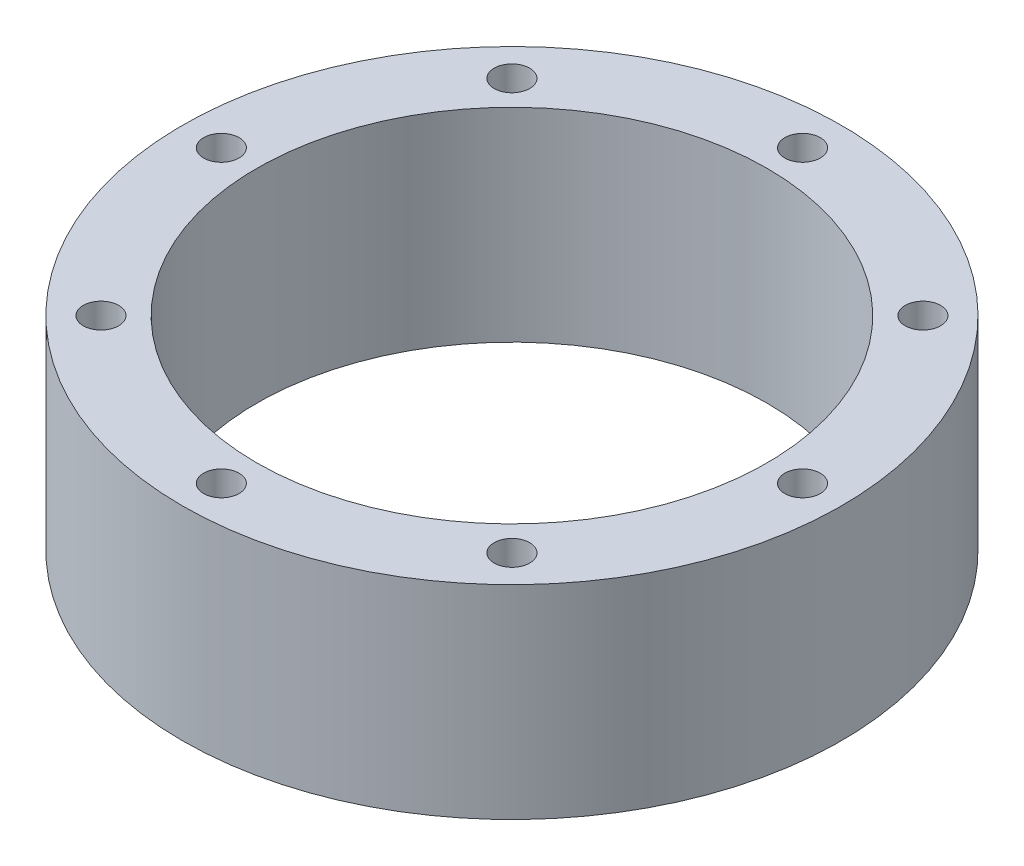
ISO-10303-21;
HEADER;
FILE_DESCRIPTION(('STEP AP214'),'2;1');
FILE_NAME('part.step','',(''),(''),'','','');
FILE_SCHEMA(('AUTOMOTIVE_DESIGN { 1 0 10303 214 1 1 1 1 }'));
ENDSEC;
DATA;
#1=APPLICATION_CONTEXT('core data for automotive mechanical design processes');
#2=APPLICATION_PROTOCOL_DEFINITION('international standard','automotive_design',2000,#1);
#3=PRODUCT_CONTEXT('',#1,'mechanical');
#4=PRODUCT('Part','Part','',(#3));
#5=PRODUCT_RELATED_PRODUCT_CATEGORY('part','',(#4));
#6=PRODUCT_DEFINITION_FORMATION('','',#4);
#7=PRODUCT_DEFINITION_CONTEXT('part definition',#1,'design');
#8=PRODUCT_DEFINITION('design','',#6,#7);
#9=PRODUCT_DEFINITION_SHAPE('','',#8);
#10=(LENGTH_UNIT() NAMED_UNIT(*) SI_UNIT(.MILLI.,.METRE.));
#11=(NAMED_UNIT(*) PLANE_ANGLE_UNIT() SI_UNIT($,.RADIAN.));
#12=(NAMED_UNIT(*) SI_UNIT($,.STERADIAN.) SOLID_ANGLE_UNIT());
#13=UNCERTAINTY_MEASURE_WITH_UNIT(LENGTH_MEASURE(1.E-05),#10,'distance_accuracy_value','');
#14=(GEOMETRIC_REPRESENTATION_CONTEXT(3) GLOBAL_UNCERTAINTY_ASSIGNED_CONTEXT((#13)) GLOBAL_UNIT_ASSIGNED_CONTEXT((#10,
#11,#12)) REPRESENTATION_CONTEXT('',''));
#15=CARTESIAN_POINT('',(0.,0.,0.));
#16=DIRECTION('',(0.,0.,1.));
#17=DIRECTION('',(1.,0.,0.));
#18=AXIS2_PLACEMENT_3D('',#15,#16,#17);
#19=CARTESIAN_POINT('',(0.,28.7,0.));
#20=DIRECTION('',(0.,1.,0.));
#21=DIRECTION('',(0.,0.,1.));
#22=AXIS2_PLACEMENT_3D('',#19,#20,#21);
#23=PLANE('',#22);
#24=CARTESIAN_POINT('',(0.,28.7,-41.));
#25=DIRECTION('',(0.,1.,0.));
#26=DIRECTION('',(0.,0.,1.));
#27=AXIS2_PLACEMENT_3D('',#24,#25,#26);
#28=CIRCLE('',#27,2.5);
#29=CARTESIAN_POINT('',(0.,28.7,-38.5));
#30=VERTEX_POINT('',#29);
#31=EDGE_CURVE('E96',#30,#30,#28,.T.);
#32=ORIENTED_EDGE('',*,*,#31,.F.);
#33=EDGE_LOOP('',(#32));
#34=FACE_BOUND('',#33,.T.);
#35=CARTESIAN_POINT('',(28.991378028649,28.7,-28.9913780286484));
#36=DIRECTION('',(0.,1.,0.));
#37=DIRECTION('',(0.,0.,1.));
#38=AXIS2_PLACEMENT_3D('',#35,#36,#37);
#39=CIRCLE('',#38,2.4999999999996);
#40=CARTESIAN_POINT('',(28.991378028649,28.7,-26.4913780286488));
#41=VERTEX_POINT('',#40);
#42=EDGE_CURVE('E93',#41,#41,#39,.T.);
#43=ORIENTED_EDGE('',*,*,#42,.F.);
#44=EDGE_LOOP('',(#43));
#45=FACE_BOUND('',#44,.T.);
#46=CARTESIAN_POINT('',(41.0000000000009,28.7,3.57978890157532E-13));
#47=DIRECTION('',(0.,1.,0.));
#48=DIRECTION('',(0.,0.,1.));
#49=AXIS2_PLACEMENT_3D('',#46,#47,#48);
#50=CIRCLE('',#49,2.49999999999953);
#51=CARTESIAN_POINT('',(41.0000000000009,28.7,2.49999999999989));
#52=VERTEX_POINT('',#51);
#53=EDGE_CURVE('E87',#52,#52,#50,.T.);
#54=ORIENTED_EDGE('',*,*,#53,.F.);
#55=EDGE_LOOP('',(#54));
#56=FACE_BOUND('',#55,.T.);
#57=CARTESIAN_POINT('',(28.9913780286484,28.7,28.9913780286484));
#58=DIRECTION('',(0.,1.,0.));
#59=DIRECTION('',(0.,0.,1.));
#60=AXIS2_PLACEMENT_3D('',#57,#58,#59);
#61=CIRCLE('',#60,2.50000000000021);
#62=CARTESIAN_POINT('',(28.9913780286484,28.7,31.4913780286487));
#63=VERTEX_POINT('',#62);
#64=EDGE_CURVE('E81',#63,#63,#61,.T.);
#65=ORIENTED_EDGE('',*,*,#64,.F.);
#66=EDGE_LOOP('',(#65));
#67=FACE_BOUND('',#66,.T.);
#68=CARTESIAN_POINT('',(0.,28.7,41.));
#69=DIRECTION('',(0.,1.,0.));
#70=DIRECTION('',(0.,0.,1.));
#71=AXIS2_PLACEMENT_3D('',#68,#69,#70);
#72=CIRCLE('',#71,2.50000000000028);
#73=CARTESIAN_POINT('',(0.,28.7,43.5000000000003));
#74=VERTEX_POINT('',#73);
#75=EDGE_CURVE('E75',#74,#74,#72,.T.);
#76=ORIENTED_EDGE('',*,*,#75,.F.);
#77=EDGE_LOOP('',(#76));
#78=FACE_BOUND('',#77,.T.);
#79=CARTESIAN_POINT('',(-28.9913780286484,28.7,28.9913780286485));
#80=DIRECTION('',(0.,1.,0.));
#81=DIRECTION('',(0.,0.,1.));
#82=AXIS2_PLACEMENT_3D('',#79,#80,#81);
#83=CIRCLE('',#82,2.50000000000035);
#84=CARTESIAN_POINT('',(-28.9913780286484,28.7,31.4913780286488));
#85=VERTEX_POINT('',#84);
#86=EDGE_CURVE('E69',#85,#85,#83,.T.);
#87=ORIENTED_EDGE('',*,*,#86,.F.);
#88=EDGE_LOOP('',(#87));
#89=FACE_BOUND('',#88,.T.);
#90=CARTESIAN_POINT('',(-41.,28.7,0.));
#91=DIRECTION('',(0.,1.,0.));
#92=DIRECTION('',(0.,0.,1.));
#93=AXIS2_PLACEMENT_3D('',#90,#91,#92);
#94=CIRCLE('',#93,2.50000000000041);
#95=CARTESIAN_POINT('',(-41.,28.7,2.50000000000042));
#96=VERTEX_POINT('',#95);
#97=EDGE_CURVE('E63',#96,#96,#94,.T.);
#98=ORIENTED_EDGE('',*,*,#97,.F.);
#99=EDGE_LOOP('',(#98));
#100=FACE_BOUND('',#99,.T.);
#101=CARTESIAN_POINT('',(-28.9913780286488,28.7,-28.9913780286481));
#102=DIRECTION('',(0.,1.,0.));
#103=DIRECTION('',(0.,0.,1.));
#104=AXIS2_PLACEMENT_3D('',#101,#102,#103);
#105=CIRCLE('',#104,2.50000000000097);
#106=CARTESIAN_POINT('',(-28.9913780286488,28.7,-26.4913780286471));
#107=VERTEX_POINT('',#106);
#108=EDGE_CURVE('E57',#107,#107,#105,.T.);
#109=ORIENTED_EDGE('',*,*,#108,.F.);
#110=EDGE_LOOP('',(#109));
#111=FACE_BOUND('',#110,.T.);
#112=CARTESIAN_POINT('',(0.,28.7,0.));
#113=DIRECTION('',(0.,1.,0.));
#114=DIRECTION('',(0.,0.,1.));
#115=AXIS2_PLACEMENT_3D('',#112,#113,#114);
#116=CIRCLE('',#115,46.5);
#117=CARTESIAN_POINT('',(0.,28.7,46.5));
#118=VERTEX_POINT('',#117);
#119=EDGE_CURVE('E10',#118,#118,#116,.T.);
#120=ORIENTED_EDGE('',*,*,#119,.T.);
#121=EDGE_LOOP('',(#120));
#122=FACE_BOUND('',#121,.T.);
#123=CARTESIAN_POINT('',(0.,28.7,0.));
#124=DIRECTION('',(0.,1.,0.));
#125=DIRECTION('',(0.,0.,1.));
#126=AXIS2_PLACEMENT_3D('',#123,#124,#125);
#127=CIRCLE('',#126,36.);
#128=CARTESIAN_POINT('',(0.,28.7,36.));
#129=VERTEX_POINT('',#128);
#130=EDGE_CURVE('E46',#129,#129,#127,.T.);
#131=ORIENTED_EDGE('',*,*,#130,.F.);
#132=EDGE_LOOP('',(#131));
#133=FACE_BOUND('',#132,.T.);
#134=ADVANCED_FACE('F35',(#34,#45,#56,#67,#78,#89,#100,#111,#122,#133),#23,.T.);
#135=CARTESIAN_POINT('',(0.,0.,0.));
#136=DIRECTION('',(0.,1.,0.));
#137=DIRECTION('',(0.,0.,1.));
#138=AXIS2_PLACEMENT_3D('',#135,#136,#137);
#139=PLANE('',#138);
#140=CARTESIAN_POINT('',(0.,0.,-41.));
#141=DIRECTION('',(0.,1.,0.));
#142=DIRECTION('',(0.,0.,1.));
#143=AXIS2_PLACEMENT_3D('',#140,#141,#142);
#144=CIRCLE('',#143,2.5);
#145=CARTESIAN_POINT('',(0.,0.,-38.5));
#146=VERTEX_POINT('',#145);
#147=EDGE_CURVE('E51',#146,#146,#144,.T.);
#148=ORIENTED_EDGE('',*,*,#147,.T.);
#149=EDGE_LOOP('',(#148));
#150=FACE_BOUND('',#149,.T.);
#151=CARTESIAN_POINT('',(28.991378028649,0.,-28.9913780286484));
#152=DIRECTION('',(0.,1.,0.));
#153=DIRECTION('',(0.,0.,1.));
#154=AXIS2_PLACEMENT_3D('',#151,#152,#153);
#155=CIRCLE('',#154,2.4999999999996);
#156=CARTESIAN_POINT('',(28.991378028649,0.,-26.4913780286488));
#157=VERTEX_POINT('',#156);
#158=EDGE_CURVE('E90',#157,#157,#155,.T.);
#159=ORIENTED_EDGE('',*,*,#158,.T.);
#160=EDGE_LOOP('',(#159));
#161=FACE_BOUND('',#160,.T.);
#162=CARTESIAN_POINT('',(41.0000000000009,0.,3.57978890157532E-13));
#163=DIRECTION('',(0.,1.,0.));
#164=DIRECTION('',(0.,0.,1.));
#165=AXIS2_PLACEMENT_3D('',#162,#163,#164);
#166=CIRCLE('',#165,2.49999999999953);
#167=CARTESIAN_POINT('',(41.0000000000009,0.,2.49999999999989));
#168=VERTEX_POINT('',#167);
#169=EDGE_CURVE('E84',#168,#168,#166,.T.);
#170=ORIENTED_EDGE('',*,*,#169,.T.);
#171=EDGE_LOOP('',(#170));
#172=FACE_BOUND('',#171,.T.);
#173=CARTESIAN_POINT('',(28.9913780286484,0.,28.9913780286484));
#174=DIRECTION('',(0.,1.,0.));
#175=DIRECTION('',(0.,0.,1.));
#176=AXIS2_PLACEMENT_3D('',#173,#174,#175);
#177=CIRCLE('',#176,2.50000000000021);
#178=CARTESIAN_POINT('',(28.9913780286484,0.,31.4913780286487));
#179=VERTEX_POINT('',#178);
#180=EDGE_CURVE('E78',#179,#179,#177,.T.);
#181=ORIENTED_EDGE('',*,*,#180,.T.);
#182=EDGE_LOOP('',(#181));
#183=FACE_BOUND('',#182,.T.);
#184=CARTESIAN_POINT('',(0.,0.,41.));
#185=DIRECTION('',(0.,1.,0.));
#186=DIRECTION('',(0.,0.,1.));
#187=AXIS2_PLACEMENT_3D('',#184,#185,#186);
#188=CIRCLE('',#187,2.50000000000028);
#189=CARTESIAN_POINT('',(0.,0.,43.5000000000003));
#190=VERTEX_POINT('',#189);
#191=EDGE_CURVE('E72',#190,#190,#188,.T.);
#192=ORIENTED_EDGE('',*,*,#191,.T.);
#193=EDGE_LOOP('',(#192));
#194=FACE_BOUND('',#193,.T.);
#195=CARTESIAN_POINT('',(-28.9913780286484,0.,28.9913780286485));
#196=DIRECTION('',(0.,1.,0.));
#197=DIRECTION('',(0.,0.,1.));
#198=AXIS2_PLACEMENT_3D('',#195,#196,#197);
#199=CIRCLE('',#198,2.50000000000035);
#200=CARTESIAN_POINT('',(-28.9913780286484,0.,31.4913780286488));
#201=VERTEX_POINT('',#200);
#202=EDGE_CURVE('E66',#201,#201,#199,.T.);
#203=ORIENTED_EDGE('',*,*,#202,.T.);
#204=EDGE_LOOP('',(#203));
#205=FACE_BOUND('',#204,.T.);
#206=CARTESIAN_POINT('',(-41.,0.,0.));
#207=DIRECTION('',(0.,1.,0.));
#208=DIRECTION('',(0.,0.,1.));
#209=AXIS2_PLACEMENT_3D('',#206,#207,#208);
#210=CIRCLE('',#209,2.50000000000041);
#211=CARTESIAN_POINT('',(-41.,0.,2.50000000000042));
#212=VERTEX_POINT('',#211);
#213=EDGE_CURVE('E60',#212,#212,#210,.T.);
#214=ORIENTED_EDGE('',*,*,#213,.T.);
#215=EDGE_LOOP('',(#214));
#216=FACE_BOUND('',#215,.T.);
#217=CARTESIAN_POINT('',(-28.9913780286488,0.,-28.9913780286481));
#218=DIRECTION('',(0.,1.,0.));
#219=DIRECTION('',(0.,0.,1.));
#220=AXIS2_PLACEMENT_3D('',#217,#218,#219);
#221=CIRCLE('',#220,2.50000000000097);
#222=CARTESIAN_POINT('',(-28.9913780286488,0.,-26.4913780286471));
#223=VERTEX_POINT('',#222);
#224=EDGE_CURVE('E54',#223,#223,#221,.T.);
#225=ORIENTED_EDGE('',*,*,#224,.T.);
#226=EDGE_LOOP('',(#225));
#227=FACE_BOUND('',#226,.T.);
#228=CARTESIAN_POINT('',(0.,0.,0.));
#229=DIRECTION('',(0.,1.,0.));
#230=DIRECTION('',(0.,0.,1.));
#231=AXIS2_PLACEMENT_3D('',#228,#229,#230);
#232=CIRCLE('',#231,46.5);
#233=CARTESIAN_POINT('',(0.,0.,46.5));
#234=VERTEX_POINT('',#233);
#235=EDGE_CURVE('E39',#234,#234,#232,.T.);
#236=ORIENTED_EDGE('',*,*,#235,.F.);
#237=EDGE_LOOP('',(#236));
#238=FACE_BOUND('',#237,.T.);
#239=CARTESIAN_POINT('',(0.,0.,0.));
#240=DIRECTION('',(0.,1.,0.));
#241=DIRECTION('',(0.,0.,1.));
#242=AXIS2_PLACEMENT_3D('',#239,#240,#241);
#243=CIRCLE('',#242,36.);
#244=CARTESIAN_POINT('',(0.,0.,36.));
#245=VERTEX_POINT('',#244);
#246=EDGE_CURVE('E48',#245,#245,#243,.T.);
#247=ORIENTED_EDGE('',*,*,#246,.T.);
#248=EDGE_LOOP('',(#247));
#249=FACE_BOUND('',#248,.T.);
#250=ADVANCED_FACE('F102',(#150,#161,#172,#183,#194,#205,#216,#227,#238,#249),#139,.F.);
#251=CARTESIAN_POINT('',(0.,28.7,0.));
#252=DIRECTION('',(0.,-1.,0.));
#253=DIRECTION('',(0.,0.,-1.));
#254=AXIS2_PLACEMENT_3D('',#251,#252,#253);
#255=CYLINDRICAL_SURFACE('',#254,46.5);
#256=ORIENTED_EDGE('',*,*,#119,.F.);
#257=EDGE_LOOP('',(#256));
#258=FACE_BOUND('',#257,.T.);
#259=ORIENTED_EDGE('',*,*,#235,.T.);
#260=EDGE_LOOP('',(#259));
#261=FACE_BOUND('',#260,.T.);
#262=ADVANCED_FACE('F37',(#258,#261),#255,.T.);
#263=CARTESIAN_POINT('',(0.,28.7,0.));
#264=DIRECTION('',(0.,-1.,0.));
#265=DIRECTION('',(0.,0.,-1.));
#266=AXIS2_PLACEMENT_3D('',#263,#264,#265);
#267=CYLINDRICAL_SURFACE('',#266,36.);
#268=ORIENTED_EDGE('',*,*,#130,.T.);
#269=EDGE_LOOP('',(#268));
#270=FACE_BOUND('',#269,.T.);
#271=ORIENTED_EDGE('',*,*,#246,.F.);
#272=EDGE_LOOP('',(#271));
#273=FACE_BOUND('',#272,.T.);
#274=ADVANCED_FACE('F131',(#270,#273),#267,.F.);
#275=CARTESIAN_POINT('',(-28.9913780286488,0.,-28.9913780286481));
#276=DIRECTION('',(0.,1.,0.));
#277=DIRECTION('',(0.,0.,1.));
#278=AXIS2_PLACEMENT_3D('',#275,#276,#277);
#279=CYLINDRICAL_SURFACE('',#278,2.50000000000097);
#280=ORIENTED_EDGE('',*,*,#224,.F.);
#281=EDGE_LOOP('',(#280));
#282=FACE_BOUND('',#281,.T.);
#283=ORIENTED_EDGE('',*,*,#108,.T.);
#284=EDGE_LOOP('',(#283));
#285=FACE_BOUND('',#284,.T.);
#286=ADVANCED_FACE('F134',(#282,#285),#279,.F.);
#287=CARTESIAN_POINT('',(-41.,0.,0.));
#288=DIRECTION('',(0.,1.,0.));
#289=DIRECTION('',(0.,0.,1.));
#290=AXIS2_PLACEMENT_3D('',#287,#288,#289);
#291=CYLINDRICAL_SURFACE('',#290,2.50000000000041);
#292=ORIENTED_EDGE('',*,*,#213,.F.);
#293=EDGE_LOOP('',(#292));
#294=FACE_BOUND('',#293,.T.);
#295=ORIENTED_EDGE('',*,*,#97,.T.);
#296=EDGE_LOOP('',(#295));
#297=FACE_BOUND('',#296,.T.);
#298=ADVANCED_FACE('F147',(#294,#297),#291,.F.);
#299=CARTESIAN_POINT('',(-28.9913780286484,0.,28.9913780286485));
#300=DIRECTION('',(0.,1.,0.));
#301=DIRECTION('',(0.,0.,1.));
#302=AXIS2_PLACEMENT_3D('',#299,#300,#301);
#303=CYLINDRICAL_SURFACE('',#302,2.50000000000035);
#304=ORIENTED_EDGE('',*,*,#202,.F.);
#305=EDGE_LOOP('',(#304));
#306=FACE_BOUND('',#305,.T.);
#307=ORIENTED_EDGE('',*,*,#86,.T.);
#308=EDGE_LOOP('',(#307));
#309=FACE_BOUND('',#308,.T.);
#310=ADVANCED_FACE('F151',(#306,#309),#303,.F.);
#311=CARTESIAN_POINT('',(0.,0.,41.));
#312=DIRECTION('',(0.,1.,0.));
#313=DIRECTION('',(0.,0.,1.));
#314=AXIS2_PLACEMENT_3D('',#311,#312,#313);
#315=CYLINDRICAL_SURFACE('',#314,2.50000000000028);
#316=ORIENTED_EDGE('',*,*,#191,.F.);
#317=EDGE_LOOP('',(#316));
#318=FACE_BOUND('',#317,.T.);
#319=ORIENTED_EDGE('',*,*,#75,.T.);
#320=EDGE_LOOP('',(#319));
#321=FACE_BOUND('',#320,.T.);
#322=ADVANCED_FACE('F155',(#318,#321),#315,.F.);
#323=CARTESIAN_POINT('',(28.9913780286484,0.,28.9913780286484));
#324=DIRECTION('',(0.,1.,0.));
#325=DIRECTION('',(0.,0.,1.));
#326=AXIS2_PLACEMENT_3D('',#323,#324,#325);
#327=CYLINDRICAL_SURFACE('',#326,2.50000000000021);
#328=ORIENTED_EDGE('',*,*,#180,.F.);
#329=EDGE_LOOP('',(#328));
#330=FACE_BOUND('',#329,.T.);
#331=ORIENTED_EDGE('',*,*,#64,.T.);
#332=EDGE_LOOP('',(#331));
#333=FACE_BOUND('',#332,.T.);
#334=ADVANCED_FACE('F159',(#330,#333),#327,.F.);
#335=CARTESIAN_POINT('',(41.0000000000009,0.,3.57978890157532E-13));
#336=DIRECTION('',(0.,1.,0.));
#337=DIRECTION('',(0.,0.,1.));
#338=AXIS2_PLACEMENT_3D('',#335,#336,#337);
#339=CYLINDRICAL_SURFACE('',#338,2.49999999999953);
#340=ORIENTED_EDGE('',*,*,#169,.F.);
#341=EDGE_LOOP('',(#340));
#342=FACE_BOUND('',#341,.T.);
#343=ORIENTED_EDGE('',*,*,#53,.T.);
#344=EDGE_LOOP('',(#343));
#345=FACE_BOUND('',#344,.T.);
#346=ADVANCED_FACE('F163',(#342,#345),#339,.F.);
#347=CARTESIAN_POINT('',(28.991378028649,0.,-28.9913780286484));
#348=DIRECTION('',(0.,1.,0.));
#349=DIRECTION('',(0.,0.,1.));
#350=AXIS2_PLACEMENT_3D('',#347,#348,#349);
#351=CYLINDRICAL_SURFACE('',#350,2.4999999999996);
#352=ORIENTED_EDGE('',*,*,#158,.F.);
#353=EDGE_LOOP('',(#352));
#354=FACE_BOUND('',#353,.T.);
#355=ORIENTED_EDGE('',*,*,#42,.T.);
#356=EDGE_LOOP('',(#355));
#357=FACE_BOUND('',#356,.T.);
#358=ADVANCED_FACE('F108',(#354,#357),#351,.F.);
#359=CARTESIAN_POINT('',(0.,0.,-41.));
#360=DIRECTION('',(0.,1.,0.));
#361=DIRECTION('',(0.,0.,1.));
#362=AXIS2_PLACEMENT_3D('',#359,#360,#361);
#363=CYLINDRICAL_SURFACE('',#362,2.5);
#364=ORIENTED_EDGE('',*,*,#147,.F.);
#365=EDGE_LOOP('',(#364));
#366=FACE_BOUND('',#365,.T.);
#367=ORIENTED_EDGE('',*,*,#31,.T.);
#368=EDGE_LOOP('',(#367));
#369=FACE_BOUND('',#368,.T.);
#370=ADVANCED_FACE('F105',(#366,#369),#363,.F.);
#371=CLOSED_SHELL('',(#134,#250,#262,#274,#286,#298,#310,#322,#334,#346,#358,#370));
#372=MANIFOLD_SOLID_BREP('B2',#371);
#373=ADVANCED_BREP_SHAPE_REPRESENTATION('',(#18,#372),#14);
#374=SHAPE_DEFINITION_REPRESENTATION(#9,#373);
ENDSEC;
END-ISO-10303-21;
